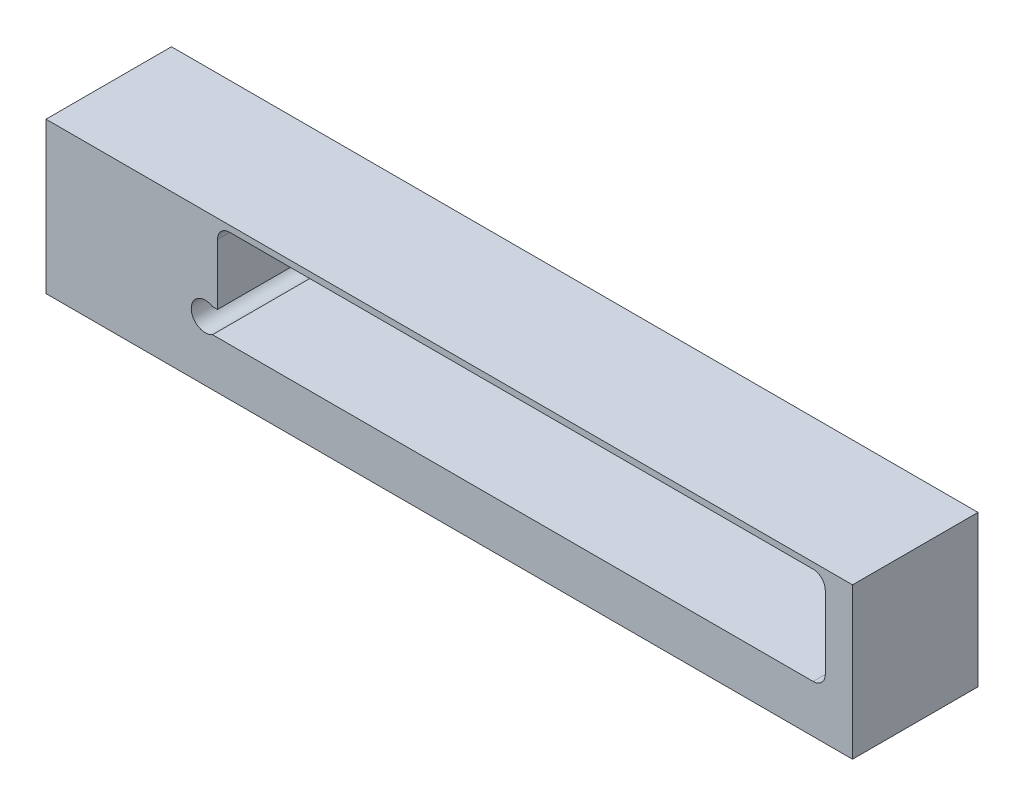
ISO-10303-21;
HEADER;
FILE_DESCRIPTION(('STEP AP214'),'2;1');
FILE_NAME('part.step','',(''),(''),'','','');
FILE_SCHEMA(('AUTOMOTIVE_DESIGN { 1 0 10303 214 1 1 1 1 }'));
ENDSEC;
DATA;
#1=APPLICATION_CONTEXT('core data for automotive mechanical design processes');
#2=APPLICATION_PROTOCOL_DEFINITION('international standard','automotive_design',2000,#1);
#3=PRODUCT_CONTEXT('',#1,'mechanical');
#4=PRODUCT('Part','Part','',(#3));
#5=PRODUCT_RELATED_PRODUCT_CATEGORY('part','',(#4));
#6=PRODUCT_DEFINITION_FORMATION('','',#4);
#7=PRODUCT_DEFINITION_CONTEXT('part definition',#1,'design');
#8=PRODUCT_DEFINITION('design','',#6,#7);
#9=PRODUCT_DEFINITION_SHAPE('','',#8);
#10=(LENGTH_UNIT() NAMED_UNIT(*) SI_UNIT(.MILLI.,.METRE.));
#11=(NAMED_UNIT(*) PLANE_ANGLE_UNIT() SI_UNIT($,.RADIAN.));
#12=(NAMED_UNIT(*) SI_UNIT($,.STERADIAN.) SOLID_ANGLE_UNIT());
#13=UNCERTAINTY_MEASURE_WITH_UNIT(LENGTH_MEASURE(1.E-05),#10,'distance_accuracy_value','');
#14=(GEOMETRIC_REPRESENTATION_CONTEXT(3) GLOBAL_UNCERTAINTY_ASSIGNED_CONTEXT((#13)) GLOBAL_UNIT_ASSIGNED_CONTEXT((#10,
#11,#12)) REPRESENTATION_CONTEXT('',''));
#15=CARTESIAN_POINT('',(0.,0.,0.));
#16=DIRECTION('',(0.,0.,1.));
#17=DIRECTION('',(1.,0.,0.));
#18=AXIS2_PLACEMENT_3D('',#15,#16,#17);
#19=CARTESIAN_POINT('',(0.,-95.04,320.));
#20=DIRECTION('',(0.,0.,-1.));
#21=DIRECTION('',(-1.,0.,0.));
#22=AXIS2_PLACEMENT_3D('',#19,#20,#21);
#23=CYLINDRICAL_SURFACE('',#22,20.52);
#24=CARTESIAN_POINT('',(0.,-95.04,0.));
#25=DIRECTION('',(0.,0.,1.));
#26=DIRECTION('',(1.,0.,0.));
#27=AXIS2_PLACEMENT_3D('',#24,#25,#26);
#28=CIRCLE('',#27,20.52);
#29=CARTESIAN_POINT('',(20.52,-95.04,0.));
#30=VERTEX_POINT('',#29);
#31=EDGE_CURVE('E253',#30,#30,#28,.F.);
#32=ORIENTED_EDGE('',*,*,#31,.T.);
#33=EDGE_LOOP('',(#32));
#34=FACE_BOUND('',#33,.T.);
#35=CARTESIAN_POINT('',(0.,-95.04,165.));
#36=DIRECTION('',(0.,0.,1.));
#37=DIRECTION('',(1.,0.,0.));
#38=AXIS2_PLACEMENT_3D('',#35,#36,#37);
#39=CIRCLE('',#38,20.52);
#40=CARTESIAN_POINT('',(20.52,-95.04,165.));
#41=VERTEX_POINT('',#40);
#42=EDGE_CURVE('E11',#41,#41,#39,.F.);
#43=ORIENTED_EDGE('',*,*,#42,.F.);
#44=EDGE_LOOP('',(#43));
#45=FACE_BOUND('',#44,.T.);
#46=ADVANCED_FACE('F41',(#34,#45),#23,.F.);
#47=CARTESIAN_POINT('',(0.,95.04,320.));
#48=DIRECTION('',(0.,0.,-1.));
#49=DIRECTION('',(-1.,0.,0.));
#50=AXIS2_PLACEMENT_3D('',#47,#48,#49);
#51=CYLINDRICAL_SURFACE('',#50,20.52);
#52=CARTESIAN_POINT('',(0.,95.04,0.));
#53=DIRECTION('',(0.,0.,1.));
#54=DIRECTION('',(1.,0.,0.));
#55=AXIS2_PLACEMENT_3D('',#52,#53,#54);
#56=CIRCLE('',#55,20.52);
#57=CARTESIAN_POINT('',(20.52,95.04,0.));
#58=VERTEX_POINT('',#57);
#59=EDGE_CURVE('E228',#58,#58,#56,.T.);
#60=ORIENTED_EDGE('',*,*,#59,.F.);
#61=EDGE_LOOP('',(#60));
#62=FACE_BOUND('',#61,.T.);
#63=CARTESIAN_POINT('',(0.,95.04,165.));
#64=DIRECTION('',(0.,0.,1.));
#65=DIRECTION('',(1.,0.,0.));
#66=AXIS2_PLACEMENT_3D('',#63,#64,#65);
#67=CIRCLE('',#66,20.52);
#68=CARTESIAN_POINT('',(20.52,95.04,165.));
#69=VERTEX_POINT('',#68);
#70=EDGE_CURVE('E199',#69,#69,#67,.T.);
#71=ORIENTED_EDGE('',*,*,#70,.T.);
#72=EDGE_LOOP('',(#71));
#73=FACE_BOUND('',#72,.T.);
#74=ADVANCED_FACE('F43',(#62,#73),#51,.F.);
#75=CARTESIAN_POINT('',(0.,-152.64,320.));
#76=DIRECTION('',(0.,1.,0.));
#77=DIRECTION('',(0.,0.,1.));
#78=AXIS2_PLACEMENT_3D('',#75,#76,#77);
#79=PLANE('',#78);
#80=DIRECTION('',(1.,0.,0.));
#81=VECTOR('',#80,1.);
#82=CARTESIAN_POINT('',(0.,-152.64,0.));
#83=LINE('',#82,#81);
#84=CARTESIAN_POINT('',(-406.4,-152.64,0.));
#85=VERTEX_POINT('',#84);
#86=CARTESIAN_POINT('',(1650.50809260547,-152.64,0.));
#87=VERTEX_POINT('',#86);
#88=EDGE_CURVE('E270',#85,#87,#83,.T.);
#89=ORIENTED_EDGE('',*,*,#88,.T.);
#90=DIRECTION('',(0.,0.,-1.));
#91=VECTOR('',#90,1.);
#92=CARTESIAN_POINT('',(1650.50809260547,-152.64,320.));
#93=LINE('',#92,#91);
#94=CARTESIAN_POINT('',(1650.50809260547,-152.64,320.));
#95=VERTEX_POINT('',#94);
#96=EDGE_CURVE('E50',#95,#87,#93,.T.);
#97=ORIENTED_EDGE('',*,*,#96,.F.);
#98=DIRECTION('',(1.,0.,0.));
#99=VECTOR('',#98,1.);
#100=CARTESIAN_POINT('',(0.,-152.64,320.));
#101=LINE('',#100,#99);
#102=CARTESIAN_POINT('',(-406.4,-152.64,320.));
#103=VERTEX_POINT('',#102);
#104=EDGE_CURVE('E250',#103,#95,#101,.T.);
#105=ORIENTED_EDGE('',*,*,#104,.F.);
#106=DIRECTION('',(0.,0.,-1.));
#107=VECTOR('',#106,1.);
#108=CARTESIAN_POINT('',(-406.4,-152.64,320.));
#109=LINE('',#108,#107);
#110=EDGE_CURVE('E66',#103,#85,#109,.T.);
#111=ORIENTED_EDGE('',*,*,#110,.T.);
#112=EDGE_LOOP('',(#89,#97,#105,#111));
#113=FACE_BOUND('',#112,.T.);
#114=ADVANCED_FACE('F302',(#113),#79,.F.);
#115=CARTESIAN_POINT('',(1650.50809260547,0.,320.));
#116=DIRECTION('',(-1.,0.,0.));
#117=DIRECTION('',(0.,0.,1.));
#118=AXIS2_PLACEMENT_3D('',#115,#116,#117);
#119=PLANE('',#118);
#120=DIRECTION('',(0.,1.,0.));
#121=VECTOR('',#120,1.);
#122=CARTESIAN_POINT('',(1650.50809260547,0.,0.));
#123=LINE('',#122,#121);
#124=CARTESIAN_POINT('',(1650.50809260547,232.64,0.));
#125=VERTEX_POINT('',#124);
#126=EDGE_CURVE('E273',#87,#125,#123,.T.);
#127=ORIENTED_EDGE('',*,*,#126,.T.);
#128=DIRECTION('',(0.,0.,-1.));
#129=VECTOR('',#128,1.);
#130=CARTESIAN_POINT('',(1650.50809260547,232.64,320.));
#131=LINE('',#130,#129);
#132=CARTESIAN_POINT('',(1650.50809260547,232.64,320.));
#133=VERTEX_POINT('',#132);
#134=EDGE_CURVE('E297',#133,#125,#131,.T.);
#135=ORIENTED_EDGE('',*,*,#134,.F.);
#136=DIRECTION('',(0.,1.,0.));
#137=VECTOR('',#136,1.);
#138=CARTESIAN_POINT('',(1650.50809260547,0.,320.));
#139=LINE('',#138,#137);
#140=EDGE_CURVE('E93',#95,#133,#139,.T.);
#141=ORIENTED_EDGE('',*,*,#140,.F.);
#142=ORIENTED_EDGE('',*,*,#96,.T.);
#143=EDGE_LOOP('',(#127,#135,#141,#142));
#144=FACE_BOUND('',#143,.T.);
#145=ADVANCED_FACE('F301',(#144),#119,.F.);
#146=CARTESIAN_POINT('',(0.,232.64,320.));
#147=DIRECTION('',(0.,1.,0.));
#148=DIRECTION('',(0.,0.,1.));
#149=AXIS2_PLACEMENT_3D('',#146,#147,#148);
#150=PLANE('',#149);
#151=DIRECTION('',(1.,0.,0.));
#152=VECTOR('',#151,1.);
#153=CARTESIAN_POINT('',(0.,232.64,0.));
#154=LINE('',#153,#152);
#155=CARTESIAN_POINT('',(-406.4,232.64,0.));
#156=VERTEX_POINT('',#155);
#157=EDGE_CURVE('E277',#156,#125,#154,.T.);
#158=ORIENTED_EDGE('',*,*,#157,.F.);
#159=DIRECTION('',(0.,0.,-1.));
#160=VECTOR('',#159,1.);
#161=CARTESIAN_POINT('',(-406.4,232.64,320.));
#162=LINE('',#161,#160);
#163=CARTESIAN_POINT('',(-406.4,232.64,320.));
#164=VERTEX_POINT('',#163);
#165=EDGE_CURVE('E294',#164,#156,#162,.T.);
#166=ORIENTED_EDGE('',*,*,#165,.F.);
#167=DIRECTION('',(1.,0.,0.));
#168=VECTOR('',#167,1.);
#169=CARTESIAN_POINT('',(0.,232.64,320.));
#170=LINE('',#169,#168);
#171=EDGE_CURVE('E256',#164,#133,#170,.T.);
#172=ORIENTED_EDGE('',*,*,#171,.T.);
#173=ORIENTED_EDGE('',*,*,#134,.T.);
#174=EDGE_LOOP('',(#158,#166,#172,#173));
#175=FACE_BOUND('',#174,.T.);
#176=ADVANCED_FACE('F311',(#175),#150,.T.);
#177=CARTESIAN_POINT('',(0.,0.,320.));
#178=DIRECTION('',(0.,0.,-1.));
#179=DIRECTION('',(-1.,0.,0.));
#180=AXIS2_PLACEMENT_3D('',#177,#178,#179);
#181=CYLINDRICAL_SURFACE('',#180,36.);
#182=DIRECTION('',(0.,0.,1.));
#183=VECTOR('',#182,1.);
#184=CARTESIAN_POINT('',(18.3030052177231,-31.,10.));
#185=LINE('',#184,#183);
#186=CARTESIAN_POINT('',(18.3030052177231,-31.,10.));
#187=VERTEX_POINT('',#186);
#188=CARTESIAN_POINT('',(18.3030052177231,-31.,320.));
#189=VERTEX_POINT('',#188);
#190=EDGE_CURVE('E238',#187,#189,#185,.T.);
#191=ORIENTED_EDGE('',*,*,#190,.F.);
#192=CARTESIAN_POINT('',(0.,0.,10.));
#193=DIRECTION('',(0.,0.,1.));
#194=DIRECTION('',(1.,0.,0.));
#195=AXIS2_PLACEMENT_3D('',#192,#193,#194);
#196=CIRCLE('',#195,36.);
#197=CARTESIAN_POINT('',(18.3030052177231,31.,10.));
#198=VERTEX_POINT('',#197);
#199=EDGE_CURVE('E179',#198,#187,#196,.F.);
#200=ORIENTED_EDGE('',*,*,#199,.F.);
#201=DIRECTION('',(0.,0.,1.));
#202=VECTOR('',#201,1.);
#203=CARTESIAN_POINT('',(18.3030052177231,31.,10.));
#204=LINE('',#203,#202);
#205=CARTESIAN_POINT('',(18.3030052177231,31.,320.));
#206=VERTEX_POINT('',#205);
#207=EDGE_CURVE('E241',#198,#206,#204,.T.);
#208=ORIENTED_EDGE('',*,*,#207,.T.);
#209=CARTESIAN_POINT('',(0.,0.,320.));
#210=DIRECTION('',(0.,0.,1.));
#211=DIRECTION('',(1.,0.,0.));
#212=AXIS2_PLACEMENT_3D('',#209,#210,#211);
#213=CIRCLE('',#212,36.);
#214=EDGE_CURVE('E263',#206,#189,#213,.T.);
#215=ORIENTED_EDGE('',*,*,#214,.T.);
#216=EDGE_LOOP('',(#191,#200,#208,#215));
#217=FACE_BOUND('',#216,.T.);
#218=CARTESIAN_POINT('',(0.,0.,0.));
#219=DIRECTION('',(0.,0.,1.));
#220=DIRECTION('',(1.,0.,0.));
#221=AXIS2_PLACEMENT_3D('',#218,#219,#220);
#222=CIRCLE('',#221,36.);
#223=CARTESIAN_POINT('',(36.,0.,0.));
#224=VERTEX_POINT('',#223);
#225=EDGE_CURVE('E285',#224,#224,#222,.T.);
#226=ORIENTED_EDGE('',*,*,#225,.F.);
#227=EDGE_LOOP('',(#226));
#228=FACE_BOUND('',#227,.T.);
#229=ADVANCED_FACE('F325',(#217,#228),#181,.F.);
#230=CARTESIAN_POINT('',(-406.4,0.,320.));
#231=DIRECTION('',(-1.,0.,0.));
#232=DIRECTION('',(0.,0.,1.));
#233=AXIS2_PLACEMENT_3D('',#230,#231,#232);
#234=PLANE('',#233);
#235=DIRECTION('',(0.,1.,0.));
#236=VECTOR('',#235,1.);
#237=CARTESIAN_POINT('',(-406.4,0.,0.));
#238=LINE('',#237,#236);
#239=EDGE_CURVE('E281',#85,#156,#238,.T.);
#240=ORIENTED_EDGE('',*,*,#239,.F.);
#241=ORIENTED_EDGE('',*,*,#110,.F.);
#242=DIRECTION('',(0.,1.,0.));
#243=VECTOR('',#242,1.);
#244=CARTESIAN_POINT('',(-406.4,0.,320.));
#245=LINE('',#244,#243);
#246=EDGE_CURVE('E260',#103,#164,#245,.T.);
#247=ORIENTED_EDGE('',*,*,#246,.T.);
#248=ORIENTED_EDGE('',*,*,#165,.T.);
#249=EDGE_LOOP('',(#240,#241,#247,#248));
#250=FACE_BOUND('',#249,.T.);
#251=ADVANCED_FACE('F306',(#250),#234,.T.);
#252=CARTESIAN_POINT('',(0.,0.,320.));
#253=DIRECTION('',(0.,0.,1.));
#254=DIRECTION('',(1.,0.,0.));
#255=AXIS2_PLACEMENT_3D('',#252,#253,#254);
#256=PLANE('',#255);
#257=DIRECTION('',(1.,0.,0.));
#258=VECTOR('',#257,1.);
#259=CARTESIAN_POINT('',(0.,-31.,320.));
#260=LINE('',#259,#258);
#261=CARTESIAN_POINT('',(1550.,-30.9999999999999,320.));
#262=VERTEX_POINT('',#261);
#263=EDGE_CURVE('E210',#189,#262,#260,.T.);
#264=ORIENTED_EDGE('',*,*,#263,.F.);
#265=ORIENTED_EDGE('',*,*,#214,.F.);
#266=DIRECTION('',(1.,0.,0.));
#267=VECTOR('',#266,1.);
#268=CARTESIAN_POINT('',(0.,31.,320.));
#269=LINE('',#268,#267);
#270=CARTESIAN_POINT('',(31.,31.,320.));
#271=VERTEX_POINT('',#270);
#272=EDGE_CURVE('E206',#206,#271,#269,.T.);
#273=ORIENTED_EDGE('',*,*,#272,.T.);
#274=DIRECTION('',(0.,-1.,0.));
#275=VECTOR('',#274,1.);
#276=CARTESIAN_POINT('',(31.,0.,320.));
#277=LINE('',#276,#275);
#278=CARTESIAN_POINT('',(31.,186.,320.));
#279=VERTEX_POINT('',#278);
#280=EDGE_CURVE('E202',#279,#271,#277,.T.);
#281=ORIENTED_EDGE('',*,*,#280,.F.);
#282=CARTESIAN_POINT('',(62.,186.,320.));
#283=DIRECTION('',(0.,0.,1.));
#284=DIRECTION('',(1.,0.,0.));
#285=AXIS2_PLACEMENT_3D('',#282,#283,#284);
#286=CIRCLE('',#285,31.);
#287=CARTESIAN_POINT('',(62.,217.,320.));
#288=VERTEX_POINT('',#287);
#289=EDGE_CURVE('E198',#288,#279,#286,.T.);
#290=ORIENTED_EDGE('',*,*,#289,.F.);
#291=DIRECTION('',(1.,0.,0.));
#292=VECTOR('',#291,1.);
#293=CARTESIAN_POINT('',(0.,217.,320.));
#294=LINE('',#293,#292);
#295=CARTESIAN_POINT('',(1550.,217.,320.));
#296=VERTEX_POINT('',#295);
#297=EDGE_CURVE('E57',#288,#296,#294,.T.);
#298=ORIENTED_EDGE('',*,*,#297,.T.);
#299=CARTESIAN_POINT('',(1550.,186.,320.));
#300=DIRECTION('',(0.,0.,1.));
#301=DIRECTION('',(1.,0.,0.));
#302=AXIS2_PLACEMENT_3D('',#299,#300,#301);
#303=CIRCLE('',#302,30.9999999999999);
#304=CARTESIAN_POINT('',(1581.,186.,320.));
#305=VERTEX_POINT('',#304);
#306=EDGE_CURVE('E165',#305,#296,#303,.T.);
#307=ORIENTED_EDGE('',*,*,#306,.F.);
#308=DIRECTION('',(0.,1.,0.));
#309=VECTOR('',#308,1.);
#310=CARTESIAN_POINT('',(1581.,0.,320.));
#311=LINE('',#310,#309);
#312=CARTESIAN_POINT('',(1581.,0.,320.));
#313=VERTEX_POINT('',#312);
#314=EDGE_CURVE('E218',#313,#305,#311,.T.);
#315=ORIENTED_EDGE('',*,*,#314,.F.);
#316=CARTESIAN_POINT('',(1550.,0.,320.));
#317=DIRECTION('',(0.,0.,1.));
#318=DIRECTION('',(1.,0.,0.));
#319=AXIS2_PLACEMENT_3D('',#316,#317,#318);
#320=CIRCLE('',#319,30.9999999999999);
#321=EDGE_CURVE('E214',#262,#313,#320,.T.);
#322=ORIENTED_EDGE('',*,*,#321,.F.);
#323=EDGE_LOOP('',(#264,#265,#273,#281,#290,#298,#307,#315,#322));
#324=FACE_BOUND('',#323,.T.);
#325=ORIENTED_EDGE('',*,*,#104,.T.);
#326=ORIENTED_EDGE('',*,*,#140,.T.);
#327=ORIENTED_EDGE('',*,*,#171,.F.);
#328=ORIENTED_EDGE('',*,*,#246,.F.);
#329=EDGE_LOOP('',(#325,#326,#327,#328));
#330=FACE_BOUND('',#329,.T.);
#331=ADVANCED_FACE('F313',(#324,#330),#256,.T.);
#332=CARTESIAN_POINT('',(0.,0.,0.));
#333=DIRECTION('',(0.,0.,1.));
#334=DIRECTION('',(1.,0.,0.));
#335=AXIS2_PLACEMENT_3D('',#332,#333,#334);
#336=PLANE('',#335);
#337=ORIENTED_EDGE('',*,*,#59,.T.);
#338=EDGE_LOOP('',(#337));
#339=FACE_BOUND('',#338,.T.);
#340=ORIENTED_EDGE('',*,*,#88,.F.);
#341=ORIENTED_EDGE('',*,*,#239,.T.);
#342=ORIENTED_EDGE('',*,*,#157,.T.);
#343=ORIENTED_EDGE('',*,*,#126,.F.);
#344=EDGE_LOOP('',(#340,#341,#342,#343));
#345=FACE_BOUND('',#344,.T.);
#346=ORIENTED_EDGE('',*,*,#225,.T.);
#347=EDGE_LOOP('',(#346));
#348=FACE_BOUND('',#347,.T.);
#349=ORIENTED_EDGE('',*,*,#31,.F.);
#350=EDGE_LOOP('',(#349));
#351=FACE_BOUND('',#350,.T.);
#352=ADVANCED_FACE('F304',(#339,#345,#348,#351),#336,.F.);
#353=CARTESIAN_POINT('',(0.,217.,10.));
#354=DIRECTION('',(0.,-1.,0.));
#355=DIRECTION('',(0.,0.,-1.));
#356=AXIS2_PLACEMENT_3D('',#353,#354,#355);
#357=PLANE('',#356);
#358=ORIENTED_EDGE('',*,*,#297,.F.);
#359=DIRECTION('',(0.,0.,1.));
#360=VECTOR('',#359,1.);
#361=CARTESIAN_POINT('',(62.,217.,10.));
#362=LINE('',#361,#360);
#363=CARTESIAN_POINT('',(62.,217.,10.));
#364=VERTEX_POINT('',#363);
#365=EDGE_CURVE('E143',#364,#288,#362,.T.);
#366=ORIENTED_EDGE('',*,*,#365,.F.);
#367=DIRECTION('',(1.,0.,0.));
#368=VECTOR('',#367,1.);
#369=CARTESIAN_POINT('',(0.,217.,10.));
#370=LINE('',#369,#368);
#371=CARTESIAN_POINT('',(1550.,217.,10.));
#372=VERTEX_POINT('',#371);
#373=EDGE_CURVE('E146',#364,#372,#370,.T.);
#374=ORIENTED_EDGE('',*,*,#373,.T.);
#375=DIRECTION('',(0.,0.,1.));
#376=VECTOR('',#375,1.);
#377=CARTESIAN_POINT('',(1550.,217.,10.));
#378=LINE('',#377,#376);
#379=EDGE_CURVE('E225',#372,#296,#378,.T.);
#380=ORIENTED_EDGE('',*,*,#379,.T.);
#381=EDGE_LOOP('',(#358,#366,#374,#380));
#382=FACE_BOUND('',#381,.T.);
#383=ADVANCED_FACE('F145',(#382),#357,.T.);
#384=CARTESIAN_POINT('',(1550.,186.,10.));
#385=DIRECTION('',(0.,0.,1.));
#386=DIRECTION('',(1.,0.,0.));
#387=AXIS2_PLACEMENT_3D('',#384,#385,#386);
#388=CYLINDRICAL_SURFACE('',#387,30.9999999999999);
#389=ORIENTED_EDGE('',*,*,#306,.T.);
#390=ORIENTED_EDGE('',*,*,#379,.F.);
#391=CARTESIAN_POINT('',(1550.,186.,10.));
#392=DIRECTION('',(0.,0.,1.));
#393=DIRECTION('',(1.,0.,0.));
#394=AXIS2_PLACEMENT_3D('',#391,#392,#393);
#395=CIRCLE('',#394,30.9999999999999);
#396=CARTESIAN_POINT('',(1581.,186.,10.));
#397=VERTEX_POINT('',#396);
#398=EDGE_CURVE('E154',#397,#372,#395,.T.);
#399=ORIENTED_EDGE('',*,*,#398,.F.);
#400=DIRECTION('',(0.,0.,1.));
#401=VECTOR('',#400,1.);
#402=CARTESIAN_POINT('',(1581.,186.,10.));
#403=LINE('',#402,#401);
#404=EDGE_CURVE('E229',#397,#305,#403,.T.);
#405=ORIENTED_EDGE('',*,*,#404,.T.);
#406=EDGE_LOOP('',(#389,#390,#399,#405));
#407=FACE_BOUND('',#406,.T.);
#408=ADVANCED_FACE('F374',(#407),#388,.F.);
#409=CARTESIAN_POINT('',(1581.,0.,10.));
#410=DIRECTION('',(1.,0.,0.));
#411=DIRECTION('',(0.,0.,-1.));
#412=AXIS2_PLACEMENT_3D('',#409,#410,#411);
#413=PLANE('',#412);
#414=ORIENTED_EDGE('',*,*,#314,.T.);
#415=ORIENTED_EDGE('',*,*,#404,.F.);
#416=DIRECTION('',(0.,1.,0.));
#417=VECTOR('',#416,1.);
#418=CARTESIAN_POINT('',(1581.,0.,10.));
#419=LINE('',#418,#417);
#420=CARTESIAN_POINT('',(1581.,0.,10.));
#421=VERTEX_POINT('',#420);
#422=EDGE_CURVE('E191',#421,#397,#419,.T.);
#423=ORIENTED_EDGE('',*,*,#422,.F.);
#424=DIRECTION('',(0.,0.,1.));
#425=VECTOR('',#424,1.);
#426=CARTESIAN_POINT('',(1581.,0.,10.));
#427=LINE('',#426,#425);
#428=EDGE_CURVE('E232',#421,#313,#427,.T.);
#429=ORIENTED_EDGE('',*,*,#428,.T.);
#430=EDGE_LOOP('',(#414,#415,#423,#429));
#431=FACE_BOUND('',#430,.T.);
#432=ADVANCED_FACE('F380',(#431),#413,.F.);
#433=CARTESIAN_POINT('',(1550.,0.,10.));
#434=DIRECTION('',(0.,0.,1.));
#435=DIRECTION('',(1.,0.,0.));
#436=AXIS2_PLACEMENT_3D('',#433,#434,#435);
#437=CYLINDRICAL_SURFACE('',#436,30.9999999999999);
#438=ORIENTED_EDGE('',*,*,#321,.T.);
#439=ORIENTED_EDGE('',*,*,#428,.F.);
#440=CARTESIAN_POINT('',(1550.,0.,10.));
#441=DIRECTION('',(0.,0.,1.));
#442=DIRECTION('',(1.,0.,0.));
#443=AXIS2_PLACEMENT_3D('',#440,#441,#442);
#444=CIRCLE('',#443,30.9999999999999);
#445=CARTESIAN_POINT('',(1550.,-30.9999999999999,10.));
#446=VERTEX_POINT('',#445);
#447=EDGE_CURVE('E187',#446,#421,#444,.T.);
#448=ORIENTED_EDGE('',*,*,#447,.F.);
#449=DIRECTION('',(0.,0.,1.));
#450=VECTOR('',#449,1.);
#451=CARTESIAN_POINT('',(1550.,-30.9999999999999,10.));
#452=LINE('',#451,#450);
#453=EDGE_CURVE('E235',#446,#262,#452,.T.);
#454=ORIENTED_EDGE('',*,*,#453,.T.);
#455=EDGE_LOOP('',(#438,#439,#448,#454));
#456=FACE_BOUND('',#455,.T.);
#457=ADVANCED_FACE('F388',(#456),#437,.F.);
#458=CARTESIAN_POINT('',(0.,-31.,10.));
#459=DIRECTION('',(0.,-1.,0.));
#460=DIRECTION('',(1.,0.,0.));
#461=AXIS2_PLACEMENT_3D('',#458,#459,#460);
#462=PLANE('',#461);
#463=ORIENTED_EDGE('',*,*,#263,.T.);
#464=ORIENTED_EDGE('',*,*,#453,.F.);
#465=DIRECTION('',(1.,0.,0.));
#466=VECTOR('',#465,1.);
#467=CARTESIAN_POINT('',(0.,-31.,10.));
#468=LINE('',#467,#466);
#469=EDGE_CURVE('E183',#187,#446,#468,.T.);
#470=ORIENTED_EDGE('',*,*,#469,.F.);
#471=ORIENTED_EDGE('',*,*,#190,.T.);
#472=EDGE_LOOP('',(#463,#464,#470,#471));
#473=FACE_BOUND('',#472,.T.);
#474=ADVANCED_FACE('F396',(#473),#462,.F.);
#475=CARTESIAN_POINT('',(0.,31.,10.));
#476=DIRECTION('',(0.,-1.,0.));
#477=DIRECTION('',(0.,0.,-1.));
#478=AXIS2_PLACEMENT_3D('',#475,#476,#477);
#479=PLANE('',#478);
#480=ORIENTED_EDGE('',*,*,#272,.F.);
#481=ORIENTED_EDGE('',*,*,#207,.F.);
#482=DIRECTION('',(1.,0.,0.));
#483=VECTOR('',#482,1.);
#484=CARTESIAN_POINT('',(0.,31.,10.));
#485=LINE('',#484,#483);
#486=CARTESIAN_POINT('',(31.,31.,10.));
#487=VERTEX_POINT('',#486);
#488=EDGE_CURVE('E173',#198,#487,#485,.T.);
#489=ORIENTED_EDGE('',*,*,#488,.T.);
#490=DIRECTION('',(0.,0.,1.));
#491=VECTOR('',#490,1.);
#492=CARTESIAN_POINT('',(31.,31.,10.));
#493=LINE('',#492,#491);
#494=EDGE_CURVE('E245',#487,#271,#493,.T.);
#495=ORIENTED_EDGE('',*,*,#494,.T.);
#496=EDGE_LOOP('',(#480,#481,#489,#495));
#497=FACE_BOUND('',#496,.T.);
#498=ADVANCED_FACE('F404',(#497),#479,.T.);
#499=CARTESIAN_POINT('',(31.,0.,10.));
#500=DIRECTION('',(-1.,0.,0.));
#501=DIRECTION('',(0.,-1.,0.));
#502=AXIS2_PLACEMENT_3D('',#499,#500,#501);
#503=PLANE('',#502);
#504=ORIENTED_EDGE('',*,*,#280,.T.);
#505=ORIENTED_EDGE('',*,*,#494,.F.);
#506=DIRECTION('',(0.,-1.,0.));
#507=VECTOR('',#506,1.);
#508=CARTESIAN_POINT('',(31.,0.,10.));
#509=LINE('',#508,#507);
#510=CARTESIAN_POINT('',(31.,186.,10.));
#511=VERTEX_POINT('',#510);
#512=EDGE_CURVE('E170',#511,#487,#509,.T.);
#513=ORIENTED_EDGE('',*,*,#512,.F.);
#514=DIRECTION('',(0.,0.,1.));
#515=VECTOR('',#514,1.);
#516=CARTESIAN_POINT('',(31.,186.,10.));
#517=LINE('',#516,#515);
#518=EDGE_CURVE('E153',#511,#279,#517,.T.);
#519=ORIENTED_EDGE('',*,*,#518,.T.);
#520=EDGE_LOOP('',(#504,#505,#513,#519));
#521=FACE_BOUND('',#520,.T.);
#522=ADVANCED_FACE('F412',(#521),#503,.F.);
#523=CARTESIAN_POINT('',(62.,186.,10.));
#524=DIRECTION('',(0.,0.,1.));
#525=DIRECTION('',(1.,0.,0.));
#526=AXIS2_PLACEMENT_3D('',#523,#524,#525);
#527=CYLINDRICAL_SURFACE('',#526,31.);
#528=ORIENTED_EDGE('',*,*,#289,.T.);
#529=ORIENTED_EDGE('',*,*,#518,.F.);
#530=CARTESIAN_POINT('',(62.,186.,10.));
#531=DIRECTION('',(0.,0.,1.));
#532=DIRECTION('',(1.,0.,0.));
#533=AXIS2_PLACEMENT_3D('',#530,#531,#532);
#534=CIRCLE('',#533,31.);
#535=EDGE_CURVE('E161',#364,#511,#534,.T.);
#536=ORIENTED_EDGE('',*,*,#535,.F.);
#537=ORIENTED_EDGE('',*,*,#365,.T.);
#538=EDGE_LOOP('',(#528,#529,#536,#537));
#539=FACE_BOUND('',#538,.T.);
#540=ADVANCED_FACE('F167',(#539),#527,.F.);
#541=CARTESIAN_POINT('',(0.,0.,10.));
#542=DIRECTION('',(0.,0.,1.));
#543=DIRECTION('',(1.,0.,0.));
#544=AXIS2_PLACEMENT_3D('',#541,#542,#543);
#545=PLANE('',#544);
#546=ORIENTED_EDGE('',*,*,#373,.F.);
#547=ORIENTED_EDGE('',*,*,#535,.T.);
#548=ORIENTED_EDGE('',*,*,#512,.T.);
#549=ORIENTED_EDGE('',*,*,#488,.F.);
#550=ORIENTED_EDGE('',*,*,#199,.T.);
#551=ORIENTED_EDGE('',*,*,#469,.T.);
#552=ORIENTED_EDGE('',*,*,#447,.T.);
#553=ORIENTED_EDGE('',*,*,#422,.T.);
#554=ORIENTED_EDGE('',*,*,#398,.T.);
#555=EDGE_LOOP('',(#546,#547,#548,#549,#550,#551,#552,#553,#554));
#556=FACE_BOUND('',#555,.T.);
#557=ADVANCED_FACE('F159',(#556),#545,.T.);
#558=CARTESIAN_POINT('',(0.,95.04,165.));
#559=DIRECTION('',(0.,0.,1.));
#560=DIRECTION('',(1.,0.,0.));
#561=AXIS2_PLACEMENT_3D('',#558,#559,#560);
#562=PLANE('',#561);
#563=ORIENTED_EDGE('',*,*,#70,.F.);
#564=EDGE_LOOP('',(#563));
#565=FACE_BOUND('',#564,.T.);
#566=ADVANCED_FACE('F432',(#565),#562,.F.);
#567=CARTESIAN_POINT('',(0.,-95.04,165.));
#568=DIRECTION('',(0.,0.,1.));
#569=DIRECTION('',(1.,0.,0.));
#570=AXIS2_PLACEMENT_3D('',#567,#568,#569);
#571=PLANE('',#570);
#572=ORIENTED_EDGE('',*,*,#42,.T.);
#573=EDGE_LOOP('',(#572));
#574=FACE_BOUND('',#573,.T.);
#575=ADVANCED_FACE('F458',(#574),#571,.F.);
#576=CLOSED_SHELL('',(#46,#74,#114,#145,#176,#229,#251,#331,#352,#383,#408,#432,#457,#474,#498,
#522,#540,#557,#566,#575));
#577=MANIFOLD_SOLID_BREP('B2',#576);
#578=ADVANCED_BREP_SHAPE_REPRESENTATION('',(#18,#577),#14);
#579=SHAPE_DEFINITION_REPRESENTATION(#9,#578);
ENDSEC;
END-ISO-10303-21;
